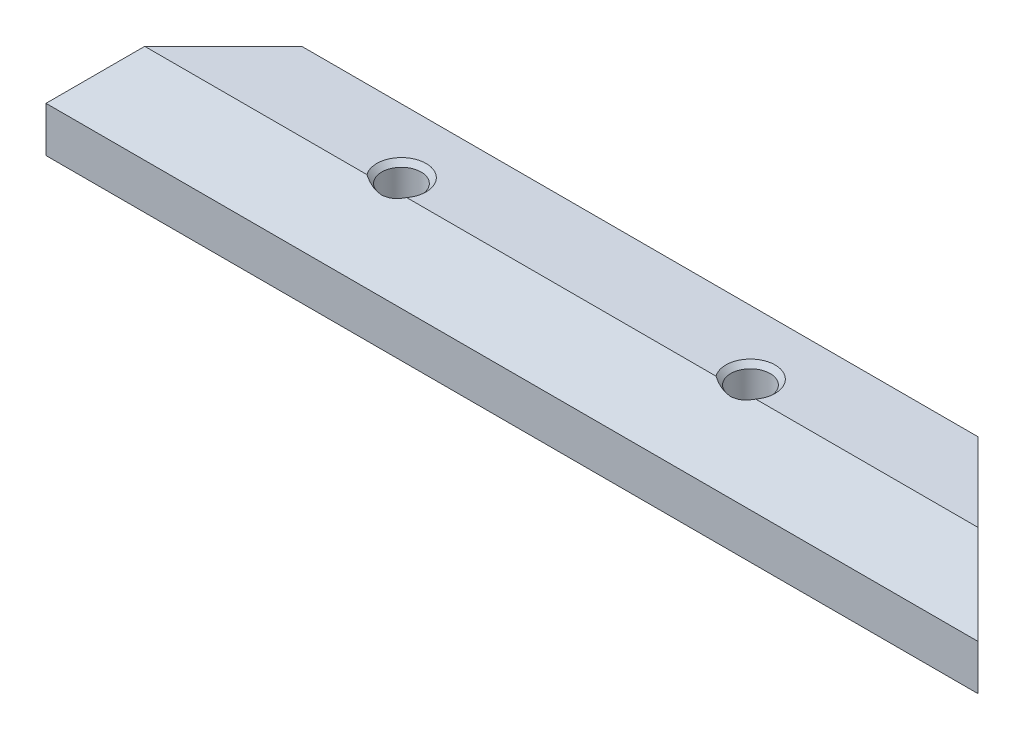
ISO-10303-21;
HEADER;
FILE_DESCRIPTION(('STEP AP214'),'2;1');
FILE_NAME('part.step','',(''),(''),'','','');
FILE_SCHEMA(('AUTOMOTIVE_DESIGN { 1 0 10303 214 1 1 1 1 }'));
ENDSEC;
DATA;
#1=APPLICATION_CONTEXT('core data for automotive mechanical design processes');
#2=APPLICATION_PROTOCOL_DEFINITION('international standard','automotive_design',2000,#1);
#3=PRODUCT_CONTEXT('',#1,'mechanical');
#4=PRODUCT('Part','Part','',(#3));
#5=PRODUCT_RELATED_PRODUCT_CATEGORY('part','',(#4));
#6=PRODUCT_DEFINITION_FORMATION('','',#4);
#7=PRODUCT_DEFINITION_CONTEXT('part definition',#1,'design');
#8=PRODUCT_DEFINITION('design','',#6,#7);
#9=PRODUCT_DEFINITION_SHAPE('','',#8);
#10=(LENGTH_UNIT() NAMED_UNIT(*) SI_UNIT(.MILLI.,.METRE.));
#11=(NAMED_UNIT(*) PLANE_ANGLE_UNIT() SI_UNIT($,.RADIAN.));
#12=(NAMED_UNIT(*) SI_UNIT($,.STERADIAN.) SOLID_ANGLE_UNIT());
#13=UNCERTAINTY_MEASURE_WITH_UNIT(LENGTH_MEASURE(1.E-05),#10,'distance_accuracy_value','');
#14=(GEOMETRIC_REPRESENTATION_CONTEXT(3) GLOBAL_UNCERTAINTY_ASSIGNED_CONTEXT((#13)) GLOBAL_UNIT_ASSIGNED_CONTEXT((#10,
#11,#12)) REPRESENTATION_CONTEXT('',''));
#15=CARTESIAN_POINT('',(0.,0.,0.));
#16=DIRECTION('',(0.,0.,1.));
#17=DIRECTION('',(1.,0.,0.));
#18=AXIS2_PLACEMENT_3D('',#15,#16,#17);
#19=CARTESIAN_POINT('',(35.3553390593204,0.,-12.955));
#20=DIRECTION('',(0.,1.,0.));
#21=DIRECTION('',(0.,0.,1.));
#22=AXIS2_PLACEMENT_3D('',#19,#20,#21);
#23=CYLINDRICAL_SURFACE('',#22,1.99999999999994);
#24=CARTESIAN_POINT('',(35.3553390593204,0.,-12.955));
#25=DIRECTION('',(0.,1.,0.));
#26=DIRECTION('',(0.,0.,1.));
#27=AXIS2_PLACEMENT_3D('',#24,#25,#26);
#28=CIRCLE('',#27,1.99999999999994);
#29=CARTESIAN_POINT('',(35.3553390593204,0.,-10.9550000000001));
#30=VERTEX_POINT('',#29);
#31=EDGE_CURVE('E239',#30,#30,#28,.T.);
#32=ORIENTED_EDGE('',*,*,#31,.F.);
#33=EDGE_LOOP('',(#32));
#34=FACE_BOUND('',#33,.T.);
#35=CARTESIAN_POINT('',(35.3553390593204,3.,-12.955));
#36=DIRECTION('',(0.,1.,0.));
#37=DIRECTION('',(0.,0.,1.));
#38=AXIS2_PLACEMENT_3D('',#35,#36,#37);
#39=CIRCLE('',#38,1.99999999999994);
#40=CARTESIAN_POINT('',(35.3553390593204,3.,-10.9550000000001));
#41=VERTEX_POINT('',#40);
#42=EDGE_CURVE('E235',#41,#41,#39,.F.);
#43=ORIENTED_EDGE('',*,*,#42,.F.);
#44=EDGE_LOOP('',(#43));
#45=FACE_BOUND('',#44,.T.);
#46=ADVANCED_FACE('F42',(#34,#45),#23,.F.);
#47=CARTESIAN_POINT('',(-35.3553390593342,0.,-12.955));
#48=DIRECTION('',(0.,1.,0.));
#49=DIRECTION('',(0.,0.,1.));
#50=AXIS2_PLACEMENT_3D('',#47,#48,#49);
#51=CYLINDRICAL_SURFACE('',#50,2.);
#52=CARTESIAN_POINT('',(-35.3553390593342,0.,-12.955));
#53=DIRECTION('',(0.,1.,0.));
#54=DIRECTION('',(0.,0.,1.));
#55=AXIS2_PLACEMENT_3D('',#52,#53,#54);
#56=CIRCLE('',#55,2.);
#57=CARTESIAN_POINT('',(-35.3553390593342,0.,-10.955));
#58=VERTEX_POINT('',#57);
#59=EDGE_CURVE('E170',#58,#58,#56,.T.);
#60=ORIENTED_EDGE('',*,*,#59,.F.);
#61=EDGE_LOOP('',(#60));
#62=FACE_BOUND('',#61,.T.);
#63=CARTESIAN_POINT('',(-35.3553390593342,3.,-12.955));
#64=DIRECTION('',(0.,1.,0.));
#65=DIRECTION('',(0.,0.,1.));
#66=AXIS2_PLACEMENT_3D('',#63,#64,#65);
#67=CIRCLE('',#66,2.);
#68=CARTESIAN_POINT('',(-35.3553390593342,3.,-10.955));
#69=VERTEX_POINT('',#68);
#70=EDGE_CURVE('E232',#69,#69,#67,.F.);
#71=ORIENTED_EDGE('',*,*,#70,.F.);
#72=EDGE_LOOP('',(#71));
#73=FACE_BOUND('',#72,.T.);
#74=ADVANCED_FACE('F312',(#62,#73),#51,.F.);
#75=CARTESIAN_POINT('',(68.5,3.,-25.91));
#76=DIRECTION('',(-0.707106781186549,0.,0.707106781186546));
#77=DIRECTION('',(0.707106781186546,0.,0.707106781186549));
#78=AXIS2_PLACEMENT_3D('',#75,#76,#77);
#79=PLANE('',#78);
#80=DIRECTION('',(-0.707106781186546,0.,-0.707106781186549));
#81=VECTOR('',#80,1.);
#82=CARTESIAN_POINT('',(68.5,19.17,-25.91));
#83=LINE('',#82,#81);
#84=CARTESIAN_POINT('',(84.41,19.17,-10.));
#85=VERTEX_POINT('',#84);
#86=CARTESIAN_POINT('',(68.5,19.17,-25.91));
#87=VERTEX_POINT('',#86);
#88=EDGE_CURVE('E138',#85,#87,#83,.T.);
#89=ORIENTED_EDGE('',*,*,#88,.F.);
#90=DIRECTION('',(-0.577350269189624,0.577350269189628,-0.577350269189626));
#91=VECTOR('',#90,1.);
#92=CARTESIAN_POINT('',(56.2733333333335,47.3066666666666,-38.1366666666666));
#93=LINE('',#92,#91);
#94=CARTESIAN_POINT('',(94.4099999999999,9.16999999999999,0.));
#95=VERTEX_POINT('',#94);
#96=EDGE_CURVE('E218',#85,#95,#93,.F.);
#97=ORIENTED_EDGE('',*,*,#96,.T.);
#98=DIRECTION('',(0.,-1.,0.));
#99=VECTOR('',#98,1.);
#100=CARTESIAN_POINT('',(94.4099999999999,3.,0.));
#101=LINE('',#100,#99);
#102=CARTESIAN_POINT('',(94.4099999999999,0.,0.));
#103=VERTEX_POINT('',#102);
#104=EDGE_CURVE('E202',#95,#103,#101,.T.);
#105=ORIENTED_EDGE('',*,*,#104,.T.);
#106=DIRECTION('',(-0.707106781186546,0.,-0.707106781186549));
#107=VECTOR('',#106,1.);
#108=CARTESIAN_POINT('',(68.5,0.,-25.91));
#109=LINE('',#108,#107);
#110=CARTESIAN_POINT('',(68.5,0.,-25.91));
#111=VERTEX_POINT('',#110);
#112=EDGE_CURVE('E156',#103,#111,#109,.T.);
#113=ORIENTED_EDGE('',*,*,#112,.T.);
#114=DIRECTION('',(0.,-1.,0.));
#115=VECTOR('',#114,1.);
#116=CARTESIAN_POINT('',(68.5,3.,-25.91));
#117=LINE('',#116,#115);
#118=EDGE_CURVE('E153',#87,#111,#117,.T.);
#119=ORIENTED_EDGE('',*,*,#118,.F.);
#120=EDGE_LOOP('',(#89,#97,#105,#113,#119));
#121=FACE_BOUND('',#120,.T.);
#122=ADVANCED_FACE('F154',(#121),#79,.F.);
#123=CARTESIAN_POINT('',(-68.5,3.,-25.91));
#124=DIRECTION('',(0.,0.,1.));
#125=DIRECTION('',(1.,0.,0.));
#126=AXIS2_PLACEMENT_3D('',#123,#124,#125);
#127=PLANE('',#126);
#128=DIRECTION('',(0.,-1.,0.));
#129=VECTOR('',#128,1.);
#130=CARTESIAN_POINT('',(64.4969448888859,15.,-25.91));
#131=LINE('',#130,#129);
#132=CARTESIAN_POINT('',(64.4969448888859,15.,-25.91));
#133=VERTEX_POINT('',#132);
#134=CARTESIAN_POINT('',(64.4969448888859,3.,-25.91));
#135=VERTEX_POINT('',#134);
#136=EDGE_CURVE('E197',#133,#135,#131,.T.);
#137=ORIENTED_EDGE('',*,*,#136,.F.);
#138=DIRECTION('',(-1.,0.,0.));
#139=VECTOR('',#138,1.);
#140=CARTESIAN_POINT('',(-68.5,15.,-25.91));
#141=LINE('',#140,#139);
#142=CARTESIAN_POINT('',(-64.496944888886,15.,-25.91));
#143=VERTEX_POINT('',#142);
#144=EDGE_CURVE('E149',#133,#143,#141,.T.);
#145=ORIENTED_EDGE('',*,*,#144,.T.);
#146=DIRECTION('',(0.,-1.,0.));
#147=VECTOR('',#146,1.);
#148=CARTESIAN_POINT('',(-64.496944888886,15.,-25.91));
#149=LINE('',#148,#147);
#150=CARTESIAN_POINT('',(-64.496944888886,3.,-25.91));
#151=VERTEX_POINT('',#150);
#152=EDGE_CURVE('E181',#143,#151,#149,.T.);
#153=ORIENTED_EDGE('',*,*,#152,.T.);
#154=DIRECTION('',(-1.,0.,0.));
#155=VECTOR('',#154,1.);
#156=CARTESIAN_POINT('',(-68.5,3.,-25.91));
#157=LINE('',#156,#155);
#158=EDGE_CURVE('E200',#135,#151,#157,.T.);
#159=ORIENTED_EDGE('',*,*,#158,.F.);
#160=EDGE_LOOP('',(#137,#145,#153,#159));
#161=FACE_BOUND('',#160,.T.);
#162=DIRECTION('',(-1.,0.,0.));
#163=VECTOR('',#162,1.);
#164=CARTESIAN_POINT('',(-68.5,0.,-25.91));
#165=LINE('',#164,#163);
#166=CARTESIAN_POINT('',(-68.5,0.,-25.91));
#167=VERTEX_POINT('',#166);
#168=EDGE_CURVE('E205',#111,#167,#165,.T.);
#169=ORIENTED_EDGE('',*,*,#168,.T.);
#170=DIRECTION('',(0.,-1.,0.));
#171=VECTOR('',#170,1.);
#172=CARTESIAN_POINT('',(-68.5,3.,-25.91));
#173=LINE('',#172,#171);
#174=CARTESIAN_POINT('',(-68.5,19.17,-25.91));
#175=VERTEX_POINT('',#174);
#176=EDGE_CURVE('E158',#175,#167,#173,.T.);
#177=ORIENTED_EDGE('',*,*,#176,.F.);
#178=DIRECTION('',(-1.,0.,0.));
#179=VECTOR('',#178,1.);
#180=CARTESIAN_POINT('',(-68.5,19.17,-25.91));
#181=LINE('',#180,#179);
#182=EDGE_CURVE('E143',#87,#175,#181,.T.);
#183=ORIENTED_EDGE('',*,*,#182,.F.);
#184=ORIENTED_EDGE('',*,*,#118,.T.);
#185=EDGE_LOOP('',(#169,#177,#183,#184));
#186=FACE_BOUND('',#185,.T.);
#187=ADVANCED_FACE('F160',(#161,#186),#127,.F.);
#188=CARTESIAN_POINT('',(-94.4099999999999,3.,0.));
#189=DIRECTION('',(0.707106781186549,0.,0.707106781186547));
#190=DIRECTION('',(0.707106781186547,0.,-0.707106781186549));
#191=AXIS2_PLACEMENT_3D('',#188,#189,#190);
#192=PLANE('',#191);
#193=DIRECTION('',(0.,-1.,0.));
#194=VECTOR('',#193,1.);
#195=CARTESIAN_POINT('',(-94.4099999999999,3.,0.));
#196=LINE('',#195,#194);
#197=CARTESIAN_POINT('',(-94.4099999999999,9.16999999999999,0.));
#198=VERTEX_POINT('',#197);
#199=CARTESIAN_POINT('',(-94.4099999999999,0.,0.));
#200=VERTEX_POINT('',#199);
#201=EDGE_CURVE('E213',#198,#200,#196,.T.);
#202=ORIENTED_EDGE('',*,*,#201,.F.);
#203=DIRECTION('',(-0.577350269189624,-0.577350269189628,0.577350269189626));
#204=VECTOR('',#203,1.);
#205=CARTESIAN_POINT('',(-56.2733333333334,47.3066666666666,-38.1366666666666));
#206=LINE('',#205,#204);
#207=CARTESIAN_POINT('',(-84.4099999999999,19.17,-10.));
#208=VERTEX_POINT('',#207);
#209=EDGE_CURVE('E223',#198,#208,#206,.F.);
#210=ORIENTED_EDGE('',*,*,#209,.T.);
#211=DIRECTION('',(-0.707106781186546,0.,0.707106781186548));
#212=VECTOR('',#211,1.);
#213=CARTESIAN_POINT('',(-94.4099999999999,19.17,0.));
#214=LINE('',#213,#212);
#215=EDGE_CURVE('E162',#175,#208,#214,.T.);
#216=ORIENTED_EDGE('',*,*,#215,.F.);
#217=ORIENTED_EDGE('',*,*,#176,.T.);
#218=DIRECTION('',(-0.707106781186546,0.,0.707106781186548));
#219=VECTOR('',#218,1.);
#220=CARTESIAN_POINT('',(-94.4099999999999,0.,0.));
#221=LINE('',#220,#219);
#222=EDGE_CURVE('E207',#167,#200,#221,.T.);
#223=ORIENTED_EDGE('',*,*,#222,.T.);
#224=EDGE_LOOP('',(#202,#210,#216,#217,#223));
#225=FACE_BOUND('',#224,.T.);
#226=ADVANCED_FACE('F354',(#225),#192,.F.);
#227=CARTESIAN_POINT('',(-94.4099999999999,3.,0.));
#228=DIRECTION('',(0.,0.,-1.));
#229=DIRECTION('',(-1.,0.,0.));
#230=AXIS2_PLACEMENT_3D('',#227,#228,#229);
#231=PLANE('',#230);
#232=ORIENTED_EDGE('',*,*,#104,.F.);
#233=DIRECTION('',(-1.,0.,0.));
#234=VECTOR('',#233,1.);
#235=CARTESIAN_POINT('',(-94.4099999999999,9.16999999999999,0.));
#236=LINE('',#235,#234);
#237=EDGE_CURVE('E221',#95,#198,#236,.T.);
#238=ORIENTED_EDGE('',*,*,#237,.T.);
#239=ORIENTED_EDGE('',*,*,#201,.T.);
#240=DIRECTION('',(1.,0.,0.));
#241=VECTOR('',#240,1.);
#242=CARTESIAN_POINT('',(-94.4099999999999,0.,0.));
#243=LINE('',#242,#241);
#244=EDGE_CURVE('E203',#200,#103,#243,.T.);
#245=ORIENTED_EDGE('',*,*,#244,.T.);
#246=EDGE_LOOP('',(#232,#238,#239,#245));
#247=FACE_BOUND('',#246,.T.);
#248=ADVANCED_FACE('F347',(#247),#231,.F.);
#249=CARTESIAN_POINT('',(0.,3.,0.));
#250=DIRECTION('',(0.,1.,0.));
#251=DIRECTION('',(0.,0.,1.));
#252=AXIS2_PLACEMENT_3D('',#249,#250,#251);
#253=PLANE('',#252);
#254=CARTESIAN_POINT('',(-64.496944888886,3.,24.09));
#255=DIRECTION('',(0.,1.,0.));
#256=DIRECTION('',(0.,0.,1.));
#257=AXIS2_PLACEMENT_3D('',#254,#255,#256);
#258=CIRCLE('',#257,50.);
#259=CARTESIAN_POINT('',(-45.5272552156842,3.,-22.1717647058823));
#260=VERTEX_POINT('',#259);
#261=EDGE_CURVE('E175',#260,#151,#258,.T.);
#262=ORIENTED_EDGE('',*,*,#261,.F.);
#263=CARTESIAN_POINT('',(0.,3.,-133.2));
#264=DIRECTION('',(0.,-1.,0.));
#265=DIRECTION('',(0.,0.,1.));
#266=AXIS2_PLACEMENT_3D('',#263,#264,#265);
#267=CIRCLE('',#266,120.);
#268=CARTESIAN_POINT('',(45.5272552156842,3.,-22.1717647058823));
#269=VERTEX_POINT('',#268);
#270=EDGE_CURVE('E184',#269,#260,#267,.T.);
#271=ORIENTED_EDGE('',*,*,#270,.F.);
#272=CARTESIAN_POINT('',(64.4969448888859,3.,24.09));
#273=DIRECTION('',(0.,1.,0.));
#274=DIRECTION('',(0.,0.,-1.));
#275=AXIS2_PLACEMENT_3D('',#272,#273,#274);
#276=CIRCLE('',#275,50.);
#277=EDGE_CURVE('E164',#135,#269,#276,.T.);
#278=ORIENTED_EDGE('',*,*,#277,.F.);
#279=ORIENTED_EDGE('',*,*,#158,.T.);
#280=EDGE_LOOP('',(#262,#271,#278,#279));
#281=FACE_BOUND('',#280,.T.);
#282=ADVANCED_FACE('F344',(#281),#253,.T.);
#283=CARTESIAN_POINT('',(0.,0.,0.));
#284=DIRECTION('',(0.,1.,0.));
#285=DIRECTION('',(0.,0.,1.));
#286=AXIS2_PLACEMENT_3D('',#283,#284,#285);
#287=PLANE('',#286);
#288=ORIENTED_EDGE('',*,*,#59,.T.);
#289=EDGE_LOOP('',(#288));
#290=FACE_BOUND('',#289,.T.);
#291=ORIENTED_EDGE('',*,*,#31,.T.);
#292=EDGE_LOOP('',(#291));
#293=FACE_BOUND('',#292,.T.);
#294=ORIENTED_EDGE('',*,*,#112,.F.);
#295=ORIENTED_EDGE('',*,*,#244,.F.);
#296=ORIENTED_EDGE('',*,*,#222,.F.);
#297=ORIENTED_EDGE('',*,*,#168,.F.);
#298=EDGE_LOOP('',(#294,#295,#296,#297));
#299=FACE_BOUND('',#298,.T.);
#300=ADVANCED_FACE('F307',(#290,#293,#299),#287,.F.);
#301=CARTESIAN_POINT('',(64.4969448888859,15.,24.09));
#302=DIRECTION('',(0.,-1.,0.));
#303=DIRECTION('',(0.,0.,-1.));
#304=AXIS2_PLACEMENT_3D('',#301,#302,#303);
#305=CYLINDRICAL_SURFACE('',#304,50.);
#306=ORIENTED_EDGE('',*,*,#277,.T.);
#307=DIRECTION('',(0.,-1.,0.));
#308=VECTOR('',#307,1.);
#309=CARTESIAN_POINT('',(45.5272552156842,15.,-22.1717647058823));
#310=LINE('',#309,#308);
#311=CARTESIAN_POINT('',(45.5272552156842,15.,-22.1717647058823));
#312=VERTEX_POINT('',#311);
#313=EDGE_CURVE('E194',#312,#269,#310,.T.);
#314=ORIENTED_EDGE('',*,*,#313,.F.);
#315=CARTESIAN_POINT('',(64.4969448888859,15.,24.09));
#316=DIRECTION('',(0.,1.,0.));
#317=DIRECTION('',(0.,0.,-1.));
#318=AXIS2_PLACEMENT_3D('',#315,#316,#317);
#319=CIRCLE('',#318,50.);
#320=EDGE_CURVE('E171',#133,#312,#319,.T.);
#321=ORIENTED_EDGE('',*,*,#320,.F.);
#322=ORIENTED_EDGE('',*,*,#136,.T.);
#323=EDGE_LOOP('',(#306,#314,#321,#322));
#324=FACE_BOUND('',#323,.T.);
#325=ADVANCED_FACE('F339',(#324),#305,.T.);
#326=CARTESIAN_POINT('',(0.,15.,-133.2));
#327=DIRECTION('',(0.,-1.,0.));
#328=DIRECTION('',(0.,0.,-1.));
#329=AXIS2_PLACEMENT_3D('',#326,#327,#328);
#330=CYLINDRICAL_SURFACE('',#329,120.);
#331=ORIENTED_EDGE('',*,*,#270,.T.);
#332=DIRECTION('',(0.,-1.,0.));
#333=VECTOR('',#332,1.);
#334=CARTESIAN_POINT('',(-45.5272552156842,15.,-22.1717647058823));
#335=LINE('',#334,#333);
#336=CARTESIAN_POINT('',(-45.5272552156842,15.,-22.1717647058823));
#337=VERTEX_POINT('',#336);
#338=EDGE_CURVE('E191',#337,#260,#335,.T.);
#339=ORIENTED_EDGE('',*,*,#338,.F.);
#340=CARTESIAN_POINT('',(0.,15.,-133.2));
#341=DIRECTION('',(0.,-1.,0.));
#342=DIRECTION('',(0.,0.,1.));
#343=AXIS2_PLACEMENT_3D('',#340,#341,#342);
#344=CIRCLE('',#343,120.);
#345=EDGE_CURVE('E174',#312,#337,#344,.T.);
#346=ORIENTED_EDGE('',*,*,#345,.F.);
#347=ORIENTED_EDGE('',*,*,#313,.T.);
#348=EDGE_LOOP('',(#331,#339,#346,#347));
#349=FACE_BOUND('',#348,.T.);
#350=ADVANCED_FACE('F335',(#349),#330,.F.);
#351=CARTESIAN_POINT('',(-64.496944888886,15.,24.09));
#352=DIRECTION('',(0.,-1.,0.));
#353=DIRECTION('',(0.,0.,-1.));
#354=AXIS2_PLACEMENT_3D('',#351,#352,#353);
#355=CYLINDRICAL_SURFACE('',#354,50.);
#356=ORIENTED_EDGE('',*,*,#261,.T.);
#357=ORIENTED_EDGE('',*,*,#152,.F.);
#358=CARTESIAN_POINT('',(-64.496944888886,15.,24.09));
#359=DIRECTION('',(0.,1.,0.));
#360=DIRECTION('',(0.,0.,1.));
#361=AXIS2_PLACEMENT_3D('',#358,#359,#360);
#362=CIRCLE('',#361,50.);
#363=EDGE_CURVE('E178',#337,#143,#362,.T.);
#364=ORIENTED_EDGE('',*,*,#363,.F.);
#365=ORIENTED_EDGE('',*,*,#338,.T.);
#366=EDGE_LOOP('',(#356,#357,#364,#365));
#367=FACE_BOUND('',#366,.T.);
#368=ADVANCED_FACE('F329',(#367),#355,.T.);
#369=CARTESIAN_POINT('',(0.,19.17,0.));
#370=DIRECTION('',(0.,-1.,0.));
#371=DIRECTION('',(0.,0.,-1.));
#372=AXIS2_PLACEMENT_3D('',#369,#370,#371);
#373=PLANE('',#372);
#374=DIRECTION('',(1.,0.,0.));
#375=VECTOR('',#374,1.);
#376=CARTESIAN_POINT('',(0.,19.17,-10.));
#377=LINE('',#376,#375);
#378=CARTESIAN_POINT('',(-39.3886968416293,19.17,-10.));
#379=VERTEX_POINT('',#378);
#380=EDGE_CURVE('E216',#208,#379,#377,.T.);
#381=ORIENTED_EDGE('',*,*,#380,.T.);
#382=CARTESIAN_POINT('',(-35.3553390593342,19.17,-12.955));
#383=DIRECTION('',(0.,-1.,0.));
#384=DIRECTION('',(0.,0.,-1.));
#385=AXIS2_PLACEMENT_3D('',#382,#383,#384);
#386=CIRCLE('',#385,5.00000000000009);
#387=CARTESIAN_POINT('',(-31.3219812770391,19.17,-10.));
#388=VERTEX_POINT('',#387);
#389=EDGE_CURVE('E52',#379,#388,#386,.T.);
#390=ORIENTED_EDGE('',*,*,#389,.T.);
#391=CARTESIAN_POINT('',(31.3219812770253,19.17,-10.));
#392=VERTEX_POINT('',#391);
#393=EDGE_CURVE('E219',#388,#392,#377,.T.);
#394=ORIENTED_EDGE('',*,*,#393,.T.);
#395=CARTESIAN_POINT('',(35.3553390593204,19.17,-12.955));
#396=DIRECTION('',(0.,-1.,0.));
#397=DIRECTION('',(0.,0.,-1.));
#398=AXIS2_PLACEMENT_3D('',#395,#396,#397);
#399=CIRCLE('',#398,5.00000000000009);
#400=CARTESIAN_POINT('',(39.3886968416156,19.17,-10.));
#401=VERTEX_POINT('',#400);
#402=EDGE_CURVE('E282',#392,#401,#399,.T.);
#403=ORIENTED_EDGE('',*,*,#402,.T.);
#404=EDGE_CURVE('E146',#401,#85,#377,.T.);
#405=ORIENTED_EDGE('',*,*,#404,.T.);
#406=ORIENTED_EDGE('',*,*,#88,.T.);
#407=ORIENTED_EDGE('',*,*,#182,.T.);
#408=ORIENTED_EDGE('',*,*,#215,.T.);
#409=EDGE_LOOP('',(#381,#390,#394,#403,#405,#406,#407,#408));
#410=FACE_BOUND('',#409,.T.);
#411=ADVANCED_FACE('F140',(#410),#373,.F.);
#412=CARTESIAN_POINT('',(0.,15.,0.));
#413=DIRECTION('',(0.,-1.,0.));
#414=DIRECTION('',(0.,0.,-1.));
#415=AXIS2_PLACEMENT_3D('',#412,#413,#414);
#416=PLANE('',#415);
#417=ORIENTED_EDGE('',*,*,#144,.F.);
#418=ORIENTED_EDGE('',*,*,#320,.T.);
#419=ORIENTED_EDGE('',*,*,#345,.T.);
#420=ORIENTED_EDGE('',*,*,#363,.T.);
#421=EDGE_LOOP('',(#417,#418,#419,#420));
#422=FACE_BOUND('',#421,.T.);
#423=ADVANCED_FACE('F263',(#422),#416,.T.);
#424=CARTESIAN_POINT('',(0.,19.17,-10.));
#425=DIRECTION('',(0.,-0.707106781186546,-0.707106781186548));
#426=DIRECTION('',(1.,0.,0.));
#427=AXIS2_PLACEMENT_3D('',#424,#425,#426);
#428=PLANE('',#427);
#429=CARTESIAN_POINT('',(-35.3553390593342,22.125,-12.955));
#430=DIRECTION('',(0.,-0.707106781186546,-0.707106781186548));
#431=DIRECTION('',(0.,0.707106781186549,-0.707106781186547));
#432=AXIS2_PLACEMENT_3D('',#429,#430,#431);
#433=ELLIPSE('',#432,5.6568542494924,4.00000000000001);
#434=CARTESIAN_POINT('',(-35.9536491795889,18.1699999999999,-8.99999999999991));
#435=VERTEX_POINT('',#434);
#436=CARTESIAN_POINT('',(-34.7570289390795,18.1699999999999,-8.99999999999991));
#437=VERTEX_POINT('',#436);
#438=EDGE_CURVE('E228',#435,#437,#433,.F.);
#439=ORIENTED_EDGE('',*,*,#438,.F.);
#440=CARTESIAN_POINT('',(-35.9536491795889,18.1699999999999,-8.99999999999991));
#441=CARTESIAN_POINT('',(-36.038581314557,18.1763859113228,-9.00638591132283));
#442=CARTESIAN_POINT('',(-36.1232972799737,18.1841200847109,-9.01412008471089));
#443=CARTESIAN_POINT('',(-36.2921554224371,18.202214182413,-9.03221418241295));
#444=CARTESIAN_POINT('',(-36.3762976752482,18.2125737528401,-9.04257375284011));
#445=CARTESIAN_POINT('',(-36.6274501815585,18.247454815301,-9.07745481530099));
#446=CARTESIAN_POINT('',(-36.7934259042502,18.2757970304514,-9.10579703045137));
#447=CARTESIAN_POINT('',(-37.1187058988769,18.3413053763123,-9.17130537631226));
#448=CARTESIAN_POINT('',(-37.2780758758189,18.3783107504277,-9.20831075042774));
#449=CARTESIAN_POINT('',(-37.5925432928602,18.4605330439998,-9.29053304399983));
#450=CARTESIAN_POINT('',(-37.7476398448323,18.5057516557725,-9.33575165577247));
#451=CARTESIAN_POINT('',(-38.0305207821797,18.5962524706818,-9.42625247068182));
#452=CARTESIAN_POINT('',(-38.15895062628,18.6405351503513,-9.47053515035127));
#453=CARTESIAN_POINT('',(-38.4122953930816,18.7338569338251,-9.56385693382508));
#454=CARTESIAN_POINT('',(-38.5372103977451,18.7828959265985,-9.61289592659852));
#455=CARTESIAN_POINT('',(-38.7853838196336,18.8860019578628,-9.71600195786278));
#456=CARTESIAN_POINT('',(-38.9085875608926,18.9401345030679,-9.77013450306789));
#457=CARTESIAN_POINT('',(-39.1513486511318,19.0522757578777,-9.88227575787772));
#458=CARTESIAN_POINT('',(-39.2709074664442,19.1102828779769,-9.94028287797692));
#459=CARTESIAN_POINT('',(-39.3886968416293,19.17,-10.));
#460=B_SPLINE_CURVE_WITH_KNOTS('',3,(#440,#441,#442,#443,#444,#445,#446,#447,#448,#449,#450,
#451,#452,#453,#454,#455,#456,#457,#458,#459),.UNSPECIFIED.,.F.,.F.,(4,2,2,2,2,2,2,2,2,4),(0.,
0.25618662725926,0.512338740538179,1.02392207797307,1.52667483717736,2.02953130502386,
2.45797834800853,2.88641539177367,3.32141446551309,3.75623616844724),.UNSPECIFIED.);
#461=EDGE_CURVE('E276',#435,#379,#460,.T.);
#462=ORIENTED_EDGE('',*,*,#461,.T.);
#463=ORIENTED_EDGE('',*,*,#380,.F.);
#464=ORIENTED_EDGE('',*,*,#209,.F.);
#465=ORIENTED_EDGE('',*,*,#237,.F.);
#466=ORIENTED_EDGE('',*,*,#96,.F.);
#467=ORIENTED_EDGE('',*,*,#404,.F.);
#468=CARTESIAN_POINT('',(39.3886968416156,19.17,-10.));
#469=CARTESIAN_POINT('',(39.1836533820432,19.066060966142,-9.89606096614199));
#470=CARTESIAN_POINT('',(38.9730766143768,18.9672008693444,-9.79720086934444));
#471=CARTESIAN_POINT('',(38.539914341824,18.7819618561465,-9.61196185614655));
#472=CARTESIAN_POINT('',(38.3172770469669,18.6956437858443,-9.52564378584427));
#473=CARTESIAN_POINT('',(37.8677923904058,18.5411824392486,-9.3711824392486));
#474=CARTESIAN_POINT('',(37.6412692264823,18.4725734432918,-9.30257344329182));
#475=CARTESIAN_POINT('',(37.1793895526884,18.3532857731357,-9.18328577313574));
#476=CARTESIAN_POINT('',(36.9440550656881,18.3025653175001,-9.13256531750009));
#477=CARTESIAN_POINT('',(36.5820713726768,18.2411296882006,-9.07112968820064));
#478=CARTESIAN_POINT('',(36.4579066464539,18.2229304522864,-9.05293045228643));
#479=CARTESIAN_POINT('',(36.2072187082103,18.1921155109619,-9.02211551096189));
#480=CARTESIAN_POINT('',(36.0806847033068,18.1795438027441,-9.00954380274406));
#481=CARTESIAN_POINT('',(35.9536491795751,18.1699999999999,-8.99999999999989));
#482=B_SPLINE_CURVE_WITH_KNOTS('',3,(#468,#469,#470,#471,#472,#473,#474,#475,#476,#477,#478,
#479,#480,#481),.UNSPECIFIED.,.F.,.F.,(4,2,2,2,2,2,4),(0.,0.757182028362938,1.51792285351372,
2.25594893936731,2.99223965488723,3.3724153017568,3.75551343671145),.UNSPECIFIED.);
#483=CARTESIAN_POINT('',(35.953649179575,18.1699999999999,-8.9999999999999));
#484=VERTEX_POINT('',#483);
#485=EDGE_CURVE('E242',#401,#484,#482,.T.);
#486=ORIENTED_EDGE('',*,*,#485,.T.);
#487=CARTESIAN_POINT('',(35.3553390593204,22.125,-12.955));
#488=DIRECTION('',(0.,-0.707106781186546,-0.707106781186548));
#489=DIRECTION('',(0.,0.707106781186549,-0.707106781186547));
#490=AXIS2_PLACEMENT_3D('',#487,#488,#489);
#491=ELLIPSE('',#490,5.65685424949239,4.);
#492=CARTESIAN_POINT('',(34.7570289390658,18.1699999999999,-8.9999999999999));
#493=VERTEX_POINT('',#492);
#494=EDGE_CURVE('E225',#493,#484,#491,.F.);
#495=ORIENTED_EDGE('',*,*,#494,.F.);
#496=CARTESIAN_POINT('',(34.7570289390658,18.1699999999999,-8.9999999999999));
#497=CARTESIAN_POINT('',(34.6720968040977,18.1763859113228,-9.00638591132282));
#498=CARTESIAN_POINT('',(34.587380838681,18.1841200847109,-9.01412008471088));
#499=CARTESIAN_POINT('',(34.4185226962176,18.2022141824129,-9.03221418241294));
#500=CARTESIAN_POINT('',(34.3343804434065,18.2125737528401,-9.0425737528401));
#501=CARTESIAN_POINT('',(34.0832279370962,18.247454815301,-9.07745481530098));
#502=CARTESIAN_POINT('',(33.9172522144045,18.2757970304514,-9.10579703045136));
#503=CARTESIAN_POINT('',(33.5919722197778,18.3413053763122,-9.17130537631224));
#504=CARTESIAN_POINT('',(33.4326022428358,18.3783107504277,-9.20831075042772));
#505=CARTESIAN_POINT('',(33.1181348257945,18.4605330439998,-9.2905330439998));
#506=CARTESIAN_POINT('',(32.9630382738224,18.5057516557724,-9.33575165577244));
#507=CARTESIAN_POINT('',(32.680157336475,18.5962524706818,-9.42625247068178));
#508=CARTESIAN_POINT('',(32.5517274923747,18.6405351503512,-9.47053515035124));
#509=CARTESIAN_POINT('',(32.2983827255731,18.733856933825,-9.56385693382505));
#510=CARTESIAN_POINT('',(32.1734677209095,18.7828959265985,-9.61289592659849));
#511=CARTESIAN_POINT('',(31.9252942990211,18.8860019578628,-9.71600195786275));
#512=CARTESIAN_POINT('',(31.8020905577621,18.9401345030679,-9.77013450306788));
#513=CARTESIAN_POINT('',(31.5593294675228,19.0522757578777,-9.88227575787771));
#514=CARTESIAN_POINT('',(31.4397706522104,19.1102828779769,-9.94028287797692));
#515=CARTESIAN_POINT('',(31.3219812770253,19.17,-10.));
#516=B_SPLINE_CURVE_WITH_KNOTS('',3,(#496,#497,#498,#499,#500,#501,#502,#503,#504,#505,#506,
#507,#508,#509,#510,#511,#512,#513,#514,#515),.UNSPECIFIED.,.F.,.F.,(4,2,2,2,2,2,2,2,2,4),(0.,
0.256186627259252,0.512338740538178,1.02392207797306,1.52667483717734,2.02953130502383,
2.45797834800854,2.88641539177369,3.32141446551315,3.75623616844733),.UNSPECIFIED.);
#517=EDGE_CURVE('E59',#493,#392,#516,.T.);
#518=ORIENTED_EDGE('',*,*,#517,.T.);
#519=ORIENTED_EDGE('',*,*,#393,.F.);
#520=CARTESIAN_POINT('',(-31.3219812770391,19.17,-10.));
#521=CARTESIAN_POINT('',(-31.5270247366114,19.066060966142,-9.89606096614199));
#522=CARTESIAN_POINT('',(-31.7376015042778,18.9672008693444,-9.79720086934444));
#523=CARTESIAN_POINT('',(-32.1707637768307,18.7819618561465,-9.61196185614654));
#524=CARTESIAN_POINT('',(-32.3934010716877,18.6956437858443,-9.52564378584427));
#525=CARTESIAN_POINT('',(-32.8428857282488,18.5411824392486,-9.3711824392486));
#526=CARTESIAN_POINT('',(-33.0694088921723,18.4725734432918,-9.30257344329182));
#527=CARTESIAN_POINT('',(-33.5312885659662,18.3532857731357,-9.18328577313574));
#528=CARTESIAN_POINT('',(-33.7666230529666,18.3025653175001,-9.13256531750009));
#529=CARTESIAN_POINT('',(-34.1286067459778,18.2411296882006,-9.07112968820065));
#530=CARTESIAN_POINT('',(-34.2527714722006,18.2229304522864,-9.05293045228644));
#531=CARTESIAN_POINT('',(-34.5034594104443,18.1921155109619,-9.0221155109619));
#532=CARTESIAN_POINT('',(-34.6299934153477,18.1795438027441,-9.00954380274407));
#533=CARTESIAN_POINT('',(-34.7570289390795,18.1699999999999,-8.9999999999999));
#534=B_SPLINE_CURVE_WITH_KNOTS('',3,(#520,#521,#522,#523,#524,#525,#526,#527,#528,#529,#530,
#531,#532,#533),.UNSPECIFIED.,.F.,.F.,(4,2,2,2,2,2,4),(0.,0.757182028362945,1.51792285351373,
2.25594893936732,2.99223965488724,3.37241530175676,3.75551343671136),.UNSPECIFIED.);
#535=EDGE_CURVE('E271',#388,#437,#534,.T.);
#536=ORIENTED_EDGE('',*,*,#535,.T.);
#537=EDGE_LOOP('',(#439,#462,#463,#464,#465,#466,#467,#486,#495,#518,#519,#536));
#538=FACE_BOUND('',#537,.T.);
#539=ADVANCED_FACE('F255',(#538),#428,.F.);
#540=CARTESIAN_POINT('',(0.,3.,0.));
#541=DIRECTION('',(0.,1.,0.));
#542=DIRECTION('',(0.,0.,1.));
#543=AXIS2_PLACEMENT_3D('',#540,#541,#542);
#544=PLANE('',#543);
#545=CARTESIAN_POINT('',(35.3553390593204,3.,-12.955));
#546=DIRECTION('',(0.,1.,0.));
#547=DIRECTION('',(0.,0.,1.));
#548=AXIS2_PLACEMENT_3D('',#545,#546,#547);
#549=CIRCLE('',#548,4.);
#550=CARTESIAN_POINT('',(35.3553390593204,3.,-8.95500000000001));
#551=VERTEX_POINT('',#550);
#552=EDGE_CURVE('E297',#551,#551,#549,.F.);
#553=ORIENTED_EDGE('',*,*,#552,.F.);
#554=EDGE_LOOP('',(#553));
#555=FACE_BOUND('',#554,.T.);
#556=ORIENTED_EDGE('',*,*,#42,.T.);
#557=EDGE_LOOP('',(#556));
#558=FACE_BOUND('',#557,.T.);
#559=ADVANCED_FACE('F262',(#555,#558),#544,.T.);
#560=CARTESIAN_POINT('',(35.3553390593204,-11.3137084989848,-12.955));
#561=DIRECTION('',(0.,1.,0.));
#562=DIRECTION('',(0.,0.,1.));
#563=AXIS2_PLACEMENT_3D('',#560,#561,#562);
#564=CYLINDRICAL_SURFACE('',#563,4.);
#565=ORIENTED_EDGE('',*,*,#494,.T.);
#566=CARTESIAN_POINT('',(35.3553390593204,18.1699999999999,-12.955));
#567=DIRECTION('',(0.,-1.,0.));
#568=DIRECTION('',(0.,0.,-1.));
#569=AXIS2_PLACEMENT_3D('',#566,#567,#568);
#570=CIRCLE('',#569,4.);
#571=EDGE_CURVE('E13',#484,#493,#570,.F.);
#572=ORIENTED_EDGE('',*,*,#571,.T.);
#573=EDGE_LOOP('',(#565,#572));
#574=FACE_BOUND('',#573,.T.);
#575=ORIENTED_EDGE('',*,*,#552,.T.);
#576=EDGE_LOOP('',(#575));
#577=FACE_BOUND('',#576,.T.);
#578=ADVANCED_FACE('F290',(#574,#577),#564,.F.);
#579=CARTESIAN_POINT('',(0.,3.,0.));
#580=DIRECTION('',(0.,1.,0.));
#581=DIRECTION('',(0.,0.,1.));
#582=AXIS2_PLACEMENT_3D('',#579,#580,#581);
#583=PLANE('',#582);
#584=CARTESIAN_POINT('',(-35.3553390593342,3.,-12.955));
#585=DIRECTION('',(0.,1.,0.));
#586=DIRECTION('',(0.,0.,1.));
#587=AXIS2_PLACEMENT_3D('',#584,#585,#586);
#588=CIRCLE('',#587,4.00000000000001);
#589=CARTESIAN_POINT('',(-35.3553390593342,3.,-8.95500000000001));
#590=VERTEX_POINT('',#589);
#591=EDGE_CURVE('E236',#590,#590,#588,.F.);
#592=ORIENTED_EDGE('',*,*,#591,.F.);
#593=EDGE_LOOP('',(#592));
#594=FACE_BOUND('',#593,.T.);
#595=ORIENTED_EDGE('',*,*,#70,.T.);
#596=EDGE_LOOP('',(#595));
#597=FACE_BOUND('',#596,.T.);
#598=ADVANCED_FACE('F293',(#594,#597),#583,.T.);
#599=CARTESIAN_POINT('',(-35.3553390593342,-11.3137084989848,-12.955));
#600=DIRECTION('',(0.,1.,0.));
#601=DIRECTION('',(0.,0.,1.));
#602=AXIS2_PLACEMENT_3D('',#599,#600,#601);
#603=CYLINDRICAL_SURFACE('',#602,4.00000000000001);
#604=ORIENTED_EDGE('',*,*,#438,.T.);
#605=CARTESIAN_POINT('',(-35.3553390593342,18.1699999999999,-12.955));
#606=DIRECTION('',(0.,-1.,0.));
#607=DIRECTION('',(0.,0.,-1.));
#608=AXIS2_PLACEMENT_3D('',#605,#606,#607);
#609=CIRCLE('',#608,4.00000000000001);
#610=EDGE_CURVE('E231',#437,#435,#609,.F.);
#611=ORIENTED_EDGE('',*,*,#610,.T.);
#612=EDGE_LOOP('',(#604,#611));
#613=FACE_BOUND('',#612,.T.);
#614=ORIENTED_EDGE('',*,*,#591,.T.);
#615=EDGE_LOOP('',(#614));
#616=FACE_BOUND('',#615,.T.);
#617=ADVANCED_FACE('F321',(#613,#616),#603,.F.);
#618=CARTESIAN_POINT('',(-35.3553390593342,18.1699999999999,-12.955));
#619=DIRECTION('',(0.,1.,0.));
#620=DIRECTION('',(0.,0.,1.));
#621=AXIS2_PLACEMENT_3D('',#618,#619,#620);
#622=CONICAL_SURFACE('',#621,4.00000000000001,0.785398163397444);
#623=ORIENTED_EDGE('',*,*,#535,.F.);
#624=ORIENTED_EDGE('',*,*,#389,.F.);
#625=ORIENTED_EDGE('',*,*,#461,.F.);
#626=ORIENTED_EDGE('',*,*,#610,.F.);
#627=EDGE_LOOP('',(#623,#624,#625,#626));
#628=FACE_BOUND('',#627,.T.);
#629=ADVANCED_FACE('F265',(#628),#622,.F.);
#630=CARTESIAN_POINT('',(35.3553390593204,18.1699999999999,-12.955));
#631=DIRECTION('',(0.,1.,0.));
#632=DIRECTION('',(0.,0.,1.));
#633=AXIS2_PLACEMENT_3D('',#630,#631,#632);
#634=CONICAL_SURFACE('',#633,4.,0.785398163397444);
#635=ORIENTED_EDGE('',*,*,#485,.F.);
#636=ORIENTED_EDGE('',*,*,#402,.F.);
#637=ORIENTED_EDGE('',*,*,#517,.F.);
#638=ORIENTED_EDGE('',*,*,#571,.F.);
#639=EDGE_LOOP('',(#635,#636,#637,#638));
#640=FACE_BOUND('',#639,.T.);
#641=ADVANCED_FACE('F45',(#640),#634,.F.);
#642=CLOSED_SHELL('',(#46,#74,#122,#187,#226,#248,#282,#300,#325,#350,#368,#411,#423,#539,#559,
#578,#598,#617,#629,#641));
#643=MANIFOLD_SOLID_BREP('B2',#642);
#644=ADVANCED_BREP_SHAPE_REPRESENTATION('',(#18,#643),#14);
#645=SHAPE_DEFINITION_REPRESENTATION(#9,#644);
ENDSEC;
END-ISO-10303-21;
